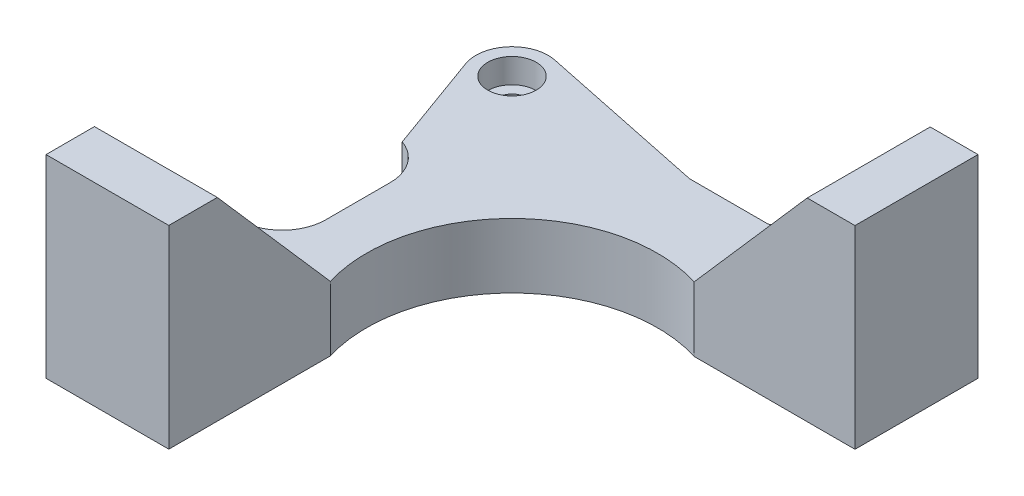
ISO-10303-21;
HEADER;
FILE_DESCRIPTION(('STEP AP214'),'2;1');
FILE_NAME('part.step','',(''),(''),'','','');
FILE_SCHEMA(('AUTOMOTIVE_DESIGN { 1 0 10303 214 1 1 1 1 }'));
ENDSEC;
DATA;
#1=APPLICATION_CONTEXT('core data for automotive mechanical design processes');
#2=APPLICATION_PROTOCOL_DEFINITION('international standard','automotive_design',2000,#1);
#3=PRODUCT_CONTEXT('',#1,'mechanical');
#4=PRODUCT('Part','Part','',(#3));
#5=PRODUCT_RELATED_PRODUCT_CATEGORY('part','',(#4));
#6=PRODUCT_DEFINITION_FORMATION('','',#4);
#7=PRODUCT_DEFINITION_CONTEXT('part definition',#1,'design');
#8=PRODUCT_DEFINITION('design','',#6,#7);
#9=PRODUCT_DEFINITION_SHAPE('','',#8);
#10=(LENGTH_UNIT() NAMED_UNIT(*) SI_UNIT(.MILLI.,.METRE.));
#11=(NAMED_UNIT(*) PLANE_ANGLE_UNIT() SI_UNIT($,.RADIAN.));
#12=(NAMED_UNIT(*) SI_UNIT($,.STERADIAN.) SOLID_ANGLE_UNIT());
#13=UNCERTAINTY_MEASURE_WITH_UNIT(LENGTH_MEASURE(1.E-05),#10,'distance_accuracy_value','');
#14=(GEOMETRIC_REPRESENTATION_CONTEXT(3) GLOBAL_UNCERTAINTY_ASSIGNED_CONTEXT((#13)) GLOBAL_UNIT_ASSIGNED_CONTEXT((#10,
#11,#12)) REPRESENTATION_CONTEXT('',''));
#15=CARTESIAN_POINT('',(0.,0.,0.));
#16=DIRECTION('',(0.,0.,1.));
#17=DIRECTION('',(1.,0.,0.));
#18=AXIS2_PLACEMENT_3D('',#15,#16,#17);
#19=CARTESIAN_POINT('',(0.,153.3525,0.));
#20=DIRECTION('',(0.,1.,0.));
#21=DIRECTION('',(0.,0.,1.));
#22=AXIS2_PLACEMENT_3D('',#19,#20,#21);
#23=PLANE('',#22);
#24=CARTESIAN_POINT('',(-41.275,153.3525,-111.125));
#25=DIRECTION('',(0.,1.,0.));
#26=DIRECTION('',(0.,0.,1.));
#27=AXIS2_PLACEMENT_3D('',#24,#25,#26);
#28=CIRCLE('',#27,4.7625);
#29=CARTESIAN_POINT('',(-41.275,153.3525,-106.3625));
#30=VERTEX_POINT('',#29);
#31=EDGE_CURVE('E489',#30,#30,#28,.T.);
#32=ORIENTED_EDGE('',*,*,#31,.F.);
#33=EDGE_LOOP('',(#32));
#34=FACE_BOUND('',#33,.T.);
#35=CARTESIAN_POINT('',(-111.125,153.3525,-41.275));
#36=DIRECTION('',(0.,1.,0.));
#37=DIRECTION('',(0.,0.,1.));
#38=AXIS2_PLACEMENT_3D('',#35,#36,#37);
#39=CIRCLE('',#38,4.7625);
#40=CARTESIAN_POINT('',(-111.125,153.3525,-36.5125));
#41=VERTEX_POINT('',#40);
#42=EDGE_CURVE('E501',#41,#41,#39,.T.);
#43=ORIENTED_EDGE('',*,*,#42,.F.);
#44=EDGE_LOOP('',(#43));
#45=FACE_BOUND('',#44,.T.);
#46=CARTESIAN_POINT('',(-111.125,153.3525,-111.125));
#47=DIRECTION('',(0.,1.,0.));
#48=DIRECTION('',(0.,0.,1.));
#49=AXIS2_PLACEMENT_3D('',#46,#47,#48);
#50=CIRCLE('',#49,4.7625);
#51=CARTESIAN_POINT('',(-111.125,153.3525,-106.3625));
#52=VERTEX_POINT('',#51);
#53=EDGE_CURVE('E513',#52,#52,#50,.T.);
#54=ORIENTED_EDGE('',*,*,#53,.F.);
#55=EDGE_LOOP('',(#54));
#56=FACE_BOUND('',#55,.T.);
#57=DIRECTION('',(-1.,0.,0.));
#58=VECTOR('',#57,1.);
#59=CARTESIAN_POINT('',(-94.0562495805783,153.3525,-36.107170818109));
#60=LINE('',#59,#58);
#61=CARTESIAN_POINT('',(-103.581249580578,153.3525,-36.107170818109));
#62=VERTEX_POINT('',#61);
#63=CARTESIAN_POINT('',(-118.197829181891,153.3525,-36.107170818109));
#64=VERTEX_POINT('',#63);
#65=EDGE_CURVE('E344',#62,#64,#60,.T.);
#66=ORIENTED_EDGE('',*,*,#65,.F.);
#67=DIRECTION('',(0.,0.,1.));
#68=VECTOR('',#67,1.);
#69=CARTESIAN_POINT('',(-103.581249580578,153.3525,-58.3437504194217));
#70=LINE('',#69,#68);
#71=CARTESIAN_POINT('',(-103.581249580578,153.3525,-58.3437504194217));
#72=VERTEX_POINT('',#71);
#73=EDGE_CURVE('E235',#72,#62,#70,.T.);
#74=ORIENTED_EDGE('',*,*,#73,.F.);
#75=DIRECTION('',(-1.,0.,0.));
#76=VECTOR('',#75,1.);
#77=CARTESIAN_POINT('',(-94.0562495805783,153.3525,-58.3437504194217));
#78=LINE('',#77,#76);
#79=CARTESIAN_POINT('',(-94.0562495805783,153.3525,-58.3437504194217));
#80=VERTEX_POINT('',#79);
#81=EDGE_CURVE('E219',#80,#72,#78,.T.);
#82=ORIENTED_EDGE('',*,*,#81,.F.);
#83=CARTESIAN_POINT('',(-66.675,153.3525,-66.675));
#84=DIRECTION('',(0.,1.,0.));
#85=DIRECTION('',(0.,0.,1.));
#86=AXIS2_PLACEMENT_3D('',#83,#84,#85);
#87=CIRCLE('',#86,28.620666452195);
#88=CARTESIAN_POINT('',(-58.204292246255,153.3525,-94.0134282342355));
#89=VERTEX_POINT('',#88);
#90=EDGE_CURVE('E233',#89,#80,#87,.T.);
#91=ORIENTED_EDGE('',*,*,#90,.F.);
#92=DIRECTION('',(0.,0.,1.));
#93=VECTOR('',#92,1.);
#94=CARTESIAN_POINT('',(-58.204292246255,153.3525,-94.0134282342355));
#95=LINE('',#94,#93);
#96=CARTESIAN_POINT('',(-58.204292246255,153.3525,-103.538428234236));
#97=VERTEX_POINT('',#96);
#98=EDGE_CURVE('E316',#97,#89,#95,.T.);
#99=ORIENTED_EDGE('',*,*,#98,.F.);
#100=DIRECTION('',(1.,0.,0.));
#101=VECTOR('',#100,1.);
#102=CARTESIAN_POINT('',(-58.204292246255,153.3525,-103.538428234236));
#103=LINE('',#102,#101);
#104=CARTESIAN_POINT('',(-36.1071708180816,153.3525,-103.538428234236));
#105=VERTEX_POINT('',#104);
#106=EDGE_CURVE('E485',#97,#105,#103,.T.);
#107=ORIENTED_EDGE('',*,*,#106,.T.);
#108=DIRECTION('',(0.,0.,1.));
#109=VECTOR('',#108,1.);
#110=CARTESIAN_POINT('',(-36.1071708180816,153.3525,-94.0134282342355));
#111=LINE('',#110,#109);
#112=CARTESIAN_POINT('',(-36.1071708180816,153.3525,-118.197829181918));
#113=VERTEX_POINT('',#112);
#114=EDGE_CURVE('E330',#113,#105,#111,.T.);
#115=ORIENTED_EDGE('',*,*,#114,.F.);
#116=DIRECTION('',(-1.,0.,0.));
#117=VECTOR('',#116,1.);
#118=CARTESIAN_POINT('',(-41.275,153.3525,-118.197829181918));
#119=LINE('',#118,#117);
#120=CARTESIAN_POINT('',(-41.275,153.3525,-118.197829181918));
#121=VERTEX_POINT('',#120);
#122=EDGE_CURVE('E311',#113,#121,#119,.T.);
#123=ORIENTED_EDGE('',*,*,#122,.T.);
#124=CARTESIAN_POINT('',(-41.275,153.3525,-111.125));
#125=DIRECTION('',(0.,1.,0.));
#126=DIRECTION('',(0.,0.,1.));
#127=AXIS2_PLACEMENT_3D('',#124,#125,#126);
#128=CIRCLE('',#127,7.07282918191839);
#129=CARTESIAN_POINT('',(-43.832903241686,153.3525,-117.719091570699));
#130=VERTEX_POINT('',#129);
#131=EDGE_CURVE('E252',#121,#130,#128,.T.);
#132=ORIENTED_EDGE('',*,*,#131,.T.);
#133=DIRECTION('',(0.932313138221565,0.,-0.361652059719639));
#134=VECTOR('',#133,1.);
#135=CARTESIAN_POINT('',(-45.4246977334963,153.3525,-117.101621181178));
#136=LINE('',#135,#134);
#137=CARTESIAN_POINT('',(-60.8319995851853,153.3525,-111.125));
#138=VERTEX_POINT('',#137);
#139=EDGE_CURVE('E255',#138,#130,#136,.T.);
#140=ORIENTED_EDGE('',*,*,#139,.F.);
#141=DIRECTION('',(-1.,0.,0.));
#142=VECTOR('',#141,1.);
#143=CARTESIAN_POINT('',(0.,153.3525,-111.125));
#144=LINE('',#143,#142);
#145=CARTESIAN_POINT('',(-76.2,153.3525,-111.125));
#146=VERTEX_POINT('',#145);
#147=EDGE_CURVE('E264',#138,#146,#144,.T.);
#148=ORIENTED_EDGE('',*,*,#147,.T.);
#149=DIRECTION('',(-0.979046593071524,0.,-0.203636363636364));
#150=VECTOR('',#149,1.);
#151=CARTESIAN_POINT('',(18.9950903919091,153.3525,-91.3249392259495));
#152=LINE('',#151,#150);
#153=CARTESIAN_POINT('',(-109.676738181818,153.3525,-118.087979369925));
#154=VERTEX_POINT('',#153);
#155=EDGE_CURVE('E266',#146,#154,#152,.T.);
#156=ORIENTED_EDGE('',*,*,#155,.T.);
#157=CARTESIAN_POINT('',(-111.125,153.3525,-111.125));
#158=DIRECTION('',(0.,1.,0.));
#159=DIRECTION('',(0.,0.,1.));
#160=AXIS2_PLACEMENT_3D('',#157,#158,#159);
#161=CIRCLE('',#160,7.112);
#162=CARTESIAN_POINT('',(-117.812544275955,153.3525,-108.704814974606));
#163=VERTEX_POINT('',#162);
#164=EDGE_CURVE('E268',#154,#163,#161,.T.);
#165=ORIENTED_EDGE('',*,*,#164,.T.);
#166=DIRECTION('',(-0.340295982198247,0.,-0.940318374009426));
#167=VECTOR('',#166,1.);
#168=CARTESIAN_POINT('',(-69.3856116478566,153.3525,25.1102663935575));
#169=LINE('',#168,#167);
#170=CARTESIAN_POINT('',(-110.73974168524,153.3525,-89.160986720071));
#171=VERTEX_POINT('',#170);
#172=EDGE_CURVE('E270',#171,#163,#169,.T.);
#173=ORIENTED_EDGE('',*,*,#172,.F.);
#174=CARTESIAN_POINT('',(-113.562518198404,153.3525,-81.0665633924503));
#175=DIRECTION('',(0.,1.,0.));
#176=DIRECTION('',(0.,0.,1.));
#177=AXIS2_PLACEMENT_3D('',#174,#175,#176);
#178=CIRCLE('',#177,8.5725);
#179=CARTESIAN_POINT('',(-104.990018198404,153.3525,-81.0665633924503));
#180=VERTEX_POINT('',#179);
#181=EDGE_CURVE('E368',#180,#171,#178,.T.);
#182=ORIENTED_EDGE('',*,*,#181,.F.);
#183=DIRECTION('',(0.,0.,1.));
#184=VECTOR('',#183,1.);
#185=CARTESIAN_POINT('',(-104.990018198404,153.3525,4.58906832912148E-13));
#186=LINE('',#185,#184);
#187=CARTESIAN_POINT('',(-104.990018198404,153.3525,-68.3665633924507));
#188=VERTEX_POINT('',#187);
#189=EDGE_CURVE('E376',#180,#188,#186,.T.);
#190=ORIENTED_EDGE('',*,*,#189,.T.);
#191=CARTESIAN_POINT('',(-113.562518198404,153.3525,-68.3665633924507));
#192=DIRECTION('',(0.,1.,0.));
#193=DIRECTION('',(0.,0.,1.));
#194=AXIS2_PLACEMENT_3D('',#191,#192,#193);
#195=CIRCLE('',#194,8.57250000000006);
#196=CARTESIAN_POINT('',(-110.711477128956,153.3525,-60.2820522093105));
#197=VERTEX_POINT('',#196);
#198=EDGE_CURVE('E378',#197,#188,#195,.T.);
#199=ORIENTED_EDGE('',*,*,#198,.F.);
#200=DIRECTION('',(-0.392129872066671,0.,0.919909867015772));
#201=VECTOR('',#200,1.);
#202=CARTESIAN_POINT('',(-115.433025578802,153.3525,-49.2056223935562));
#203=LINE('',#202,#201);
#204=CARTESIAN_POINT('',(-117.631365352139,153.3525,-44.0484676022443));
#205=VERTEX_POINT('',#204);
#206=EDGE_CURVE('E258',#197,#205,#203,.T.);
#207=ORIENTED_EDGE('',*,*,#206,.T.);
#208=CARTESIAN_POINT('',(-111.125,153.3525,-41.275));
#209=DIRECTION('',(0.,1.,0.));
#210=DIRECTION('',(0.,0.,1.));
#211=AXIS2_PLACEMENT_3D('',#208,#209,#210);
#212=CIRCLE('',#211,7.07282918189104);
#213=CARTESIAN_POINT('',(-118.197829181891,153.3525,-41.2749999999999));
#214=VERTEX_POINT('',#213);
#215=EDGE_CURVE('E253',#205,#214,#212,.T.);
#216=ORIENTED_EDGE('',*,*,#215,.T.);
#217=DIRECTION('',(0.,0.,1.));
#218=VECTOR('',#217,1.);
#219=CARTESIAN_POINT('',(-118.197829181891,153.3525,-41.2749999999999));
#220=LINE('',#219,#218);
#221=EDGE_CURVE('E360',#214,#64,#220,.T.);
#222=ORIENTED_EDGE('',*,*,#221,.T.);
#223=EDGE_LOOP('',(#66,#74,#82,#91,#99,#107,#115,#123,#132,#140,#148,#156,#165,#173,#182,#190,
#199,#207,#216,#222));
#224=FACE_BOUND('',#223,.T.);
#225=ADVANCED_FACE('F41',(#34,#45,#56,#224),#23,.T.);
#226=CARTESIAN_POINT('',(-94.0562495805783,178.7525,-36.107170818109));
#227=DIRECTION('',(0.,0.,1.));
#228=DIRECTION('',(1.,0.,0.));
#229=AXIS2_PLACEMENT_3D('',#226,#227,#228);
#230=PLANE('',#229);
#231=DIRECTION('',(0.,1.,0.));
#232=VECTOR('',#231,1.);
#233=CARTESIAN_POINT('',(-103.581249580578,178.7525,-36.107170818109));
#234=LINE('',#233,#232);
#235=CARTESIAN_POINT('',(-103.581249580578,178.7525,-36.107170818109));
#236=VERTEX_POINT('',#235);
#237=EDGE_CURVE('E237',#62,#236,#234,.T.);
#238=ORIENTED_EDGE('',*,*,#237,.F.);
#239=ORIENTED_EDGE('',*,*,#65,.T.);
#240=DIRECTION('',(0.,-1.,0.));
#241=VECTOR('',#240,1.);
#242=CARTESIAN_POINT('',(-118.197829181891,178.7525,-36.107170818109));
#243=LINE('',#242,#241);
#244=CARTESIAN_POINT('',(-118.197829181891,178.7525,-36.107170818109));
#245=VERTEX_POINT('',#244);
#246=EDGE_CURVE('E350',#245,#64,#243,.T.);
#247=ORIENTED_EDGE('',*,*,#246,.F.);
#248=DIRECTION('',(-1.,0.,0.));
#249=VECTOR('',#248,1.);
#250=CARTESIAN_POINT('',(-94.0562495805783,178.7525,-36.107170818109));
#251=LINE('',#250,#249);
#252=EDGE_CURVE('E335',#236,#245,#251,.T.);
#253=ORIENTED_EDGE('',*,*,#252,.F.);
#254=EDGE_LOOP('',(#238,#239,#247,#253));
#255=FACE_BOUND('',#254,.T.);
#256=ADVANCED_FACE('F476',(#255),#230,.F.);
#257=CARTESIAN_POINT('',(-36.1071708180816,178.7525,-94.0134282342355));
#258=DIRECTION('',(1.,0.,0.));
#259=DIRECTION('',(0.,0.,-1.));
#260=AXIS2_PLACEMENT_3D('',#257,#258,#259);
#261=PLANE('',#260);
#262=DIRECTION('',(0.,-1.,0.));
#263=VECTOR('',#262,1.);
#264=CARTESIAN_POINT('',(-36.1071708180816,178.7525,-103.538428234236));
#265=LINE('',#264,#263);
#266=CARTESIAN_POINT('',(-36.1071708180816,178.60635306077,-103.538428234236));
#267=VERTEX_POINT('',#266);
#268=EDGE_CURVE('E306',#267,#105,#265,.T.);
#269=ORIENTED_EDGE('',*,*,#268,.F.);
#270=DIRECTION('',(0.,0.,1.));
#271=VECTOR('',#270,1.);
#272=CARTESIAN_POINT('',(-36.1071708180816,178.60635306077,0.));
#273=LINE('',#272,#271);
#274=CARTESIAN_POINT('',(-36.1071708180816,178.60635306077,-118.197829181918));
#275=VERTEX_POINT('',#274);
#276=EDGE_CURVE('E297',#267,#275,#273,.F.);
#277=ORIENTED_EDGE('',*,*,#276,.T.);
#278=DIRECTION('',(0.,-1.,0.));
#279=VECTOR('',#278,1.);
#280=CARTESIAN_POINT('',(-36.1071708180816,178.7525,-118.197829181918));
#281=LINE('',#280,#279);
#282=EDGE_CURVE('E304',#275,#113,#281,.T.);
#283=ORIENTED_EDGE('',*,*,#282,.T.);
#284=ORIENTED_EDGE('',*,*,#114,.T.);
#285=EDGE_LOOP('',(#269,#277,#283,#284));
#286=FACE_BOUND('',#285,.T.);
#287=ADVANCED_FACE('F302',(#286),#261,.F.);
#288=CARTESIAN_POINT('',(-41.275,140.6525,-111.125));
#289=DIRECTION('',(0.,-1.,0.));
#290=DIRECTION('',(0.,0.,-1.));
#291=AXIS2_PLACEMENT_3D('',#288,#289,#290);
#292=PLANE('',#291);
#293=CARTESIAN_POINT('',(-41.275,140.6525,-111.125));
#294=DIRECTION('',(0.,1.,0.));
#295=DIRECTION('',(0.,0.,1.));
#296=AXIS2_PLACEMENT_3D('',#293,#294,#295);
#297=CIRCLE('',#296,2.5527);
#298=CARTESIAN_POINT('',(-41.275,140.6525,-108.5723));
#299=VERTEX_POINT('',#298);
#300=EDGE_CURVE('E498',#299,#299,#297,.T.);
#301=ORIENTED_EDGE('',*,*,#300,.T.);
#302=EDGE_LOOP('',(#301));
#303=FACE_BOUND('',#302,.T.);
#304=CARTESIAN_POINT('',(-111.125,140.6525,-41.275));
#305=DIRECTION('',(0.,1.,0.));
#306=DIRECTION('',(0.,0.,1.));
#307=AXIS2_PLACEMENT_3D('',#304,#305,#306);
#308=CIRCLE('',#307,2.55269999999999);
#309=CARTESIAN_POINT('',(-111.125,140.6525,-38.7223));
#310=VERTEX_POINT('',#309);
#311=EDGE_CURVE('E510',#310,#310,#308,.T.);
#312=ORIENTED_EDGE('',*,*,#311,.T.);
#313=EDGE_LOOP('',(#312));
#314=FACE_BOUND('',#313,.T.);
#315=CARTESIAN_POINT('',(-41.275,140.6525,-111.125));
#316=DIRECTION('',(0.,-1.,0.));
#317=DIRECTION('',(0.,0.,-1.));
#318=AXIS2_PLACEMENT_3D('',#315,#316,#317);
#319=CIRCLE('',#318,7.07282918191838);
#320=CARTESIAN_POINT('',(-43.832903241686,140.6525,-117.719091570699));
#321=VERTEX_POINT('',#320);
#322=CARTESIAN_POINT('',(-41.275,140.6525,-118.197829181918));
#323=VERTEX_POINT('',#322);
#324=EDGE_CURVE('E438',#321,#323,#319,.T.);
#325=ORIENTED_EDGE('',*,*,#324,.T.);
#326=DIRECTION('',(1.,0.,0.));
#327=VECTOR('',#326,1.);
#328=CARTESIAN_POINT('',(-41.275,140.6525,-118.197829181918));
#329=LINE('',#328,#327);
#330=CARTESIAN_POINT('',(-26.5821708180816,140.6525,-118.197829181918));
#331=VERTEX_POINT('',#330);
#332=EDGE_CURVE('E446',#323,#331,#329,.T.);
#333=ORIENTED_EDGE('',*,*,#332,.T.);
#334=DIRECTION('',(0.,0.,1.));
#335=VECTOR('',#334,1.);
#336=CARTESIAN_POINT('',(-26.5821708180816,140.6525,-118.197829181918));
#337=LINE('',#336,#335);
#338=CARTESIAN_POINT('',(-26.5821708180816,140.6525,-94.0134282342355));
#339=VERTEX_POINT('',#338);
#340=EDGE_CURVE('E449',#331,#339,#337,.T.);
#341=ORIENTED_EDGE('',*,*,#340,.T.);
#342=DIRECTION('',(-1.,0.,0.));
#343=VECTOR('',#342,1.);
#344=CARTESIAN_POINT('',(-26.5821708180816,140.6525,-94.0134282342355));
#345=LINE('',#344,#343);
#346=CARTESIAN_POINT('',(-58.204292246255,140.6525,-94.0134282342355));
#347=VERTEX_POINT('',#346);
#348=EDGE_CURVE('E458',#339,#347,#345,.T.);
#349=ORIENTED_EDGE('',*,*,#348,.T.);
#350=CARTESIAN_POINT('',(-66.675,140.6525,-66.675));
#351=DIRECTION('',(0.,1.,0.));
#352=DIRECTION('',(0.,0.,-1.));
#353=AXIS2_PLACEMENT_3D('',#350,#351,#352);
#354=CIRCLE('',#353,28.620666452195);
#355=CARTESIAN_POINT('',(-94.0562495805783,140.6525,-58.3437504194218));
#356=VERTEX_POINT('',#355);
#357=EDGE_CURVE('E460',#347,#356,#354,.T.);
#358=ORIENTED_EDGE('',*,*,#357,.T.);
#359=DIRECTION('',(0.,0.,1.));
#360=VECTOR('',#359,1.);
#361=CARTESIAN_POINT('',(-94.0562495805783,140.6525,-58.3437504194218));
#362=LINE('',#361,#360);
#363=CARTESIAN_POINT('',(-94.0562495805783,140.6525,-26.582170818109));
#364=VERTEX_POINT('',#363);
#365=EDGE_CURVE('E243',#356,#364,#362,.T.);
#366=ORIENTED_EDGE('',*,*,#365,.T.);
#367=DIRECTION('',(-1.,0.,0.));
#368=VECTOR('',#367,1.);
#369=CARTESIAN_POINT('',(-94.0562495805783,140.6525,-26.582170818109));
#370=LINE('',#369,#368);
#371=CARTESIAN_POINT('',(-118.197829181891,140.6525,-26.582170818109));
#372=VERTEX_POINT('',#371);
#373=EDGE_CURVE('E406',#364,#372,#370,.T.);
#374=ORIENTED_EDGE('',*,*,#373,.T.);
#375=DIRECTION('',(0.,0.,-1.));
#376=VECTOR('',#375,1.);
#377=CARTESIAN_POINT('',(-118.197829181891,140.6525,-26.582170818109));
#378=LINE('',#377,#376);
#379=CARTESIAN_POINT('',(-118.197829181891,140.6525,-41.2749999999999));
#380=VERTEX_POINT('',#379);
#381=EDGE_CURVE('E398',#372,#380,#378,.T.);
#382=ORIENTED_EDGE('',*,*,#381,.T.);
#383=CARTESIAN_POINT('',(-111.125,140.6525,-41.275));
#384=DIRECTION('',(0.,-1.,0.));
#385=DIRECTION('',(0.,0.,-1.));
#386=AXIS2_PLACEMENT_3D('',#383,#384,#385);
#387=CIRCLE('',#386,7.07282918189103);
#388=CARTESIAN_POINT('',(-117.631365352139,140.6525,-44.0484676022443));
#389=VERTEX_POINT('',#388);
#390=EDGE_CURVE('E393',#380,#389,#387,.T.);
#391=ORIENTED_EDGE('',*,*,#390,.T.);
#392=DIRECTION('',(0.392129872066672,0.,-0.919909867015772));
#393=VECTOR('',#392,1.);
#394=CARTESIAN_POINT('',(-117.631365352139,140.6525,-44.0484676022443));
#395=LINE('',#394,#393);
#396=CARTESIAN_POINT('',(-110.711477128956,140.6525,-60.2820522093105));
#397=VERTEX_POINT('',#396);
#398=EDGE_CURVE('E388',#389,#397,#395,.T.);
#399=ORIENTED_EDGE('',*,*,#398,.T.);
#400=CARTESIAN_POINT('',(-113.562518198404,140.6525,-68.3665633924507));
#401=DIRECTION('',(0.,1.,0.));
#402=DIRECTION('',(0.,0.,-1.));
#403=AXIS2_PLACEMENT_3D('',#400,#401,#402);
#404=CIRCLE('',#403,8.57250000000006);
#405=CARTESIAN_POINT('',(-104.990018198404,140.6525,-68.3665633924507));
#406=VERTEX_POINT('',#405);
#407=EDGE_CURVE('E413',#397,#406,#404,.T.);
#408=ORIENTED_EDGE('',*,*,#407,.T.);
#409=DIRECTION('',(0.,0.,-1.));
#410=VECTOR('',#409,1.);
#411=CARTESIAN_POINT('',(-104.990018198404,140.6525,-68.3665633924507));
#412=LINE('',#411,#410);
#413=CARTESIAN_POINT('',(-104.990018198404,140.6525,-81.0665633924503));
#414=VERTEX_POINT('',#413);
#415=EDGE_CURVE('E416',#406,#414,#412,.T.);
#416=ORIENTED_EDGE('',*,*,#415,.T.);
#417=CARTESIAN_POINT('',(-113.562518198404,140.6525,-81.0665633924503));
#418=DIRECTION('',(0.,1.,0.));
#419=DIRECTION('',(0.,0.,-1.));
#420=AXIS2_PLACEMENT_3D('',#417,#418,#419);
#421=CIRCLE('',#420,8.5725);
#422=CARTESIAN_POINT('',(-110.73974168524,140.6525,-89.160986720071));
#423=VERTEX_POINT('',#422);
#424=EDGE_CURVE('E419',#414,#423,#421,.T.);
#425=ORIENTED_EDGE('',*,*,#424,.T.);
#426=DIRECTION('',(-0.340295982198247,0.,-0.940318374009426));
#427=VECTOR('',#426,1.);
#428=CARTESIAN_POINT('',(-110.73974168524,140.6525,-89.160986720071));
#429=LINE('',#428,#427);
#430=CARTESIAN_POINT('',(-117.812544275955,140.6525,-108.704814974606));
#431=VERTEX_POINT('',#430);
#432=EDGE_CURVE('E422',#423,#431,#429,.T.);
#433=ORIENTED_EDGE('',*,*,#432,.T.);
#434=CARTESIAN_POINT('',(-111.125,140.6525,-111.125));
#435=DIRECTION('',(0.,-1.,0.));
#436=DIRECTION('',(0.,0.,-1.));
#437=AXIS2_PLACEMENT_3D('',#434,#435,#436);
#438=CIRCLE('',#437,7.11199999999999);
#439=CARTESIAN_POINT('',(-109.676738181818,140.6525,-118.087979369925));
#440=VERTEX_POINT('',#439);
#441=EDGE_CURVE('E425',#431,#440,#438,.T.);
#442=ORIENTED_EDGE('',*,*,#441,.T.);
#443=DIRECTION('',(0.979046593071524,0.,0.203636363636363));
#444=VECTOR('',#443,1.);
#445=CARTESIAN_POINT('',(-109.676738181818,140.6525,-118.087979369925));
#446=LINE('',#445,#444);
#447=CARTESIAN_POINT('',(-76.2,140.6525,-111.125));
#448=VERTEX_POINT('',#447);
#449=EDGE_CURVE('E428',#440,#448,#446,.T.);
#450=ORIENTED_EDGE('',*,*,#449,.T.);
#451=DIRECTION('',(1.,0.,0.));
#452=VECTOR('',#451,1.);
#453=CARTESIAN_POINT('',(-76.2,140.6525,-111.125));
#454=LINE('',#453,#452);
#455=CARTESIAN_POINT('',(-60.8319995851853,140.6525,-111.125));
#456=VERTEX_POINT('',#455);
#457=EDGE_CURVE('E431',#448,#456,#454,.T.);
#458=ORIENTED_EDGE('',*,*,#457,.T.);
#459=DIRECTION('',(0.932313138221565,0.,-0.361652059719639));
#460=VECTOR('',#459,1.);
#461=CARTESIAN_POINT('',(-60.8319995851853,140.6525,-111.125));
#462=LINE('',#461,#460);
#463=EDGE_CURVE('E313',#456,#321,#462,.T.);
#464=ORIENTED_EDGE('',*,*,#463,.T.);
#465=EDGE_LOOP('',(#325,#333,#341,#349,#358,#366,#374,#382,#391,#399,#408,#416,#425,#433,#442,
#450,#458,#464));
#466=FACE_BOUND('',#465,.T.);
#467=CARTESIAN_POINT('',(-111.125,140.6525,-111.125));
#468=DIRECTION('',(0.,1.,0.));
#469=DIRECTION('',(0.,0.,1.));
#470=AXIS2_PLACEMENT_3D('',#467,#468,#469);
#471=CIRCLE('',#470,2.55269999999999);
#472=CARTESIAN_POINT('',(-111.125,140.6525,-108.5723));
#473=VERTEX_POINT('',#472);
#474=EDGE_CURVE('E447',#473,#473,#471,.T.);
#475=ORIENTED_EDGE('',*,*,#474,.T.);
#476=EDGE_LOOP('',(#475));
#477=FACE_BOUND('',#476,.T.);
#478=ADVANCED_FACE('F403',(#303,#314,#466,#477),#292,.T.);
#479=DIRECTION('',(0.00121570527621527,0.,0.999999261030068));
#480=VECTOR('',#479,1.);
#481=CARTESIAN_POINT('',(-118.197829181891,153.3525,-36.107170818109));
#482=LINE('',#481,#480);
#483=CARTESIAN_POINT('',(-118.186249580578,153.3525,-26.582170818109));
#484=VERTEX_POINT('',#483);
#485=EDGE_CURVE('E336',#64,#484,#482,.T.);
#486=ORIENTED_EDGE('',*,*,#485,.F.);
#487=CARTESIAN_POINT('',(-118.197829181891,153.3525,-26.582170818109));
#488=VERTEX_POINT('',#487);
#489=EDGE_CURVE('E359',#64,#488,#220,.T.);
#490=ORIENTED_EDGE('',*,*,#489,.T.);
#491=DIRECTION('',(1.,0.,0.));
#492=VECTOR('',#491,1.);
#493=CARTESIAN_POINT('',(-111.125,153.3525,-26.582170818109));
#494=LINE('',#493,#492);
#495=EDGE_CURVE('E363',#488,#484,#494,.T.);
#496=ORIENTED_EDGE('',*,*,#495,.T.);
#497=EDGE_LOOP('',(#486,#490,#496));
#498=FACE_BOUND('',#497,.T.);
#499=ADVANCED_FACE('F467',(#498),#23,.T.);
#500=CARTESIAN_POINT('',(-111.125,153.3525,-41.275));
#501=DIRECTION('',(0.,-1.,0.));
#502=DIRECTION('',(0.,0.,-1.));
#503=AXIS2_PLACEMENT_3D('',#500,#501,#502);
#504=CYLINDRICAL_SURFACE('',#503,7.07282918189104);
#505=DIRECTION('',(0.,1.,0.));
#506=VECTOR('',#505,1.);
#507=CARTESIAN_POINT('',(-118.197829181891,150.8125,-41.2749999999999));
#508=LINE('',#507,#506);
#509=EDGE_CURVE('E365',#380,#214,#508,.T.);
#510=ORIENTED_EDGE('',*,*,#509,.T.);
#511=ORIENTED_EDGE('',*,*,#215,.F.);
#512=DIRECTION('',(0.,-1.,0.));
#513=VECTOR('',#512,1.);
#514=CARTESIAN_POINT('',(-117.631365352139,153.3525,-44.0484676022443));
#515=LINE('',#514,#513);
#516=EDGE_CURVE('E247',#205,#389,#515,.T.);
#517=ORIENTED_EDGE('',*,*,#516,.T.);
#518=ORIENTED_EDGE('',*,*,#390,.F.);
#519=EDGE_LOOP('',(#510,#511,#517,#518));
#520=FACE_BOUND('',#519,.T.);
#521=ADVANCED_FACE('F392',(#520),#504,.T.);
#522=CARTESIAN_POINT('',(-113.562518198404,153.3525,-81.0665633924503));
#523=DIRECTION('',(0.,-1.,0.));
#524=DIRECTION('',(0.,0.,-1.));
#525=AXIS2_PLACEMENT_3D('',#522,#523,#524);
#526=CYLINDRICAL_SURFACE('',#525,8.5725);
#527=DIRECTION('',(0.,-1.,0.));
#528=VECTOR('',#527,1.);
#529=CARTESIAN_POINT('',(-110.73974168524,153.3525,-89.160986720071));
#530=LINE('',#529,#528);
#531=EDGE_CURVE('E273',#171,#423,#530,.T.);
#532=ORIENTED_EDGE('',*,*,#531,.T.);
#533=ORIENTED_EDGE('',*,*,#424,.F.);
#534=DIRECTION('',(0.,-1.,0.));
#535=VECTOR('',#534,1.);
#536=CARTESIAN_POINT('',(-104.990018198404,153.3525,-81.0665633924503));
#537=LINE('',#536,#535);
#538=EDGE_CURVE('E225',#180,#414,#537,.T.);
#539=ORIENTED_EDGE('',*,*,#538,.F.);
#540=ORIENTED_EDGE('',*,*,#181,.T.);
#541=EDGE_LOOP('',(#532,#533,#539,#540));
#542=FACE_BOUND('',#541,.T.);
#543=ADVANCED_FACE('F553',(#542),#526,.F.);
#544=CARTESIAN_POINT('',(-104.990018198404,153.3525,4.58906832912148E-13));
#545=DIRECTION('',(1.,0.,0.));
#546=DIRECTION('',(0.,0.,-1.));
#547=AXIS2_PLACEMENT_3D('',#544,#545,#546);
#548=PLANE('',#547);
#549=ORIENTED_EDGE('',*,*,#538,.T.);
#550=ORIENTED_EDGE('',*,*,#415,.F.);
#551=DIRECTION('',(0.,-1.,0.));
#552=VECTOR('',#551,1.);
#553=CARTESIAN_POINT('',(-104.990018198404,153.3525,-68.3665633924507));
#554=LINE('',#553,#552);
#555=EDGE_CURVE('E289',#188,#406,#554,.T.);
#556=ORIENTED_EDGE('',*,*,#555,.F.);
#557=ORIENTED_EDGE('',*,*,#189,.F.);
#558=EDGE_LOOP('',(#549,#550,#556,#557));
#559=FACE_BOUND('',#558,.T.);
#560=ADVANCED_FACE('F918',(#559),#548,.F.);
#561=CARTESIAN_POINT('',(-113.562518198404,153.3525,-68.3665633924507));
#562=DIRECTION('',(0.,-1.,0.));
#563=DIRECTION('',(0.,0.,-1.));
#564=AXIS2_PLACEMENT_3D('',#561,#562,#563);
#565=CYLINDRICAL_SURFACE('',#564,8.57250000000006);
#566=ORIENTED_EDGE('',*,*,#555,.T.);
#567=ORIENTED_EDGE('',*,*,#407,.F.);
#568=DIRECTION('',(0.,-1.,0.));
#569=VECTOR('',#568,1.);
#570=CARTESIAN_POINT('',(-110.711477128956,153.3525,-60.2820522093105));
#571=LINE('',#570,#569);
#572=EDGE_CURVE('E287',#197,#397,#571,.T.);
#573=ORIENTED_EDGE('',*,*,#572,.F.);
#574=ORIENTED_EDGE('',*,*,#198,.T.);
#575=EDGE_LOOP('',(#566,#567,#573,#574));
#576=FACE_BOUND('',#575,.T.);
#577=ADVANCED_FACE('F929',(#576),#565,.F.);
#578=CARTESIAN_POINT('',(-115.433025578802,153.3525,-49.2056223935562));
#579=DIRECTION('',(0.919909867015772,0.,0.392129872066671));
#580=DIRECTION('',(0.392129872066671,0.,-0.919909867015772));
#581=AXIS2_PLACEMENT_3D('',#578,#579,#580);
#582=PLANE('',#581);
#583=ORIENTED_EDGE('',*,*,#572,.T.);
#584=ORIENTED_EDGE('',*,*,#398,.F.);
#585=ORIENTED_EDGE('',*,*,#516,.F.);
#586=ORIENTED_EDGE('',*,*,#206,.F.);
#587=EDGE_LOOP('',(#583,#584,#585,#586));
#588=FACE_BOUND('',#587,.T.);
#589=ADVANCED_FACE('F386',(#588),#582,.F.);
#590=CARTESIAN_POINT('',(-66.675,153.3525,-66.675));
#591=DIRECTION('',(0.,-1.,0.));
#592=DIRECTION('',(0.,0.,-1.));
#593=AXIS2_PLACEMENT_3D('',#590,#591,#592);
#594=CYLINDRICAL_SURFACE('',#593,28.620666452195);
#595=DIRECTION('',(0.,-1.,0.));
#596=VECTOR('',#595,1.);
#597=CARTESIAN_POINT('',(-94.0562495805783,153.3525,-58.3437504194217));
#598=LINE('',#597,#596);
#599=EDGE_CURVE('E240',#80,#356,#598,.T.);
#600=ORIENTED_EDGE('',*,*,#599,.T.);
#601=ORIENTED_EDGE('',*,*,#357,.F.);
#602=DIRECTION('',(0.,-1.,0.));
#603=VECTOR('',#602,1.);
#604=CARTESIAN_POINT('',(-58.204292246255,153.3525,-94.0134282342355));
#605=LINE('',#604,#603);
#606=EDGE_CURVE('E248',#89,#347,#605,.T.);
#607=ORIENTED_EDGE('',*,*,#606,.F.);
#608=ORIENTED_EDGE('',*,*,#90,.T.);
#609=EDGE_LOOP('',(#600,#601,#607,#608));
#610=FACE_BOUND('',#609,.T.);
#611=ADVANCED_FACE('F251',(#610),#594,.F.);
#612=CARTESIAN_POINT('',(-41.275,153.3525,-111.125));
#613=DIRECTION('',(0.,-1.,0.));
#614=DIRECTION('',(0.,0.,-1.));
#615=AXIS2_PLACEMENT_3D('',#612,#613,#614);
#616=CYLINDRICAL_SURFACE('',#615,7.07282918191839);
#617=ORIENTED_EDGE('',*,*,#131,.F.);
#618=DIRECTION('',(0.,1.,0.));
#619=VECTOR('',#618,1.);
#620=CARTESIAN_POINT('',(-41.275,150.8125,-118.197829181918));
#621=LINE('',#620,#619);
#622=EDGE_CURVE('E353',#323,#121,#621,.T.);
#623=ORIENTED_EDGE('',*,*,#622,.F.);
#624=ORIENTED_EDGE('',*,*,#324,.F.);
#625=DIRECTION('',(0.,-1.,0.));
#626=VECTOR('',#625,1.);
#627=CARTESIAN_POINT('',(-43.832903241686,153.3525,-117.719091570699));
#628=LINE('',#627,#626);
#629=EDGE_CURVE('E283',#130,#321,#628,.T.);
#630=ORIENTED_EDGE('',*,*,#629,.F.);
#631=EDGE_LOOP('',(#617,#623,#624,#630));
#632=FACE_BOUND('',#631,.T.);
#633=ADVANCED_FACE('F444',(#632),#616,.T.);
#634=CARTESIAN_POINT('',(-45.4246977334963,153.3525,-117.101621181178));
#635=DIRECTION('',(-0.361652059719639,0.,-0.932313138221565));
#636=DIRECTION('',(-0.932313138221565,0.,0.361652059719639));
#637=AXIS2_PLACEMENT_3D('',#634,#635,#636);
#638=PLANE('',#637);
#639=ORIENTED_EDGE('',*,*,#629,.T.);
#640=ORIENTED_EDGE('',*,*,#463,.F.);
#641=DIRECTION('',(0.,-1.,0.));
#642=VECTOR('',#641,1.);
#643=CARTESIAN_POINT('',(-60.8319995851853,153.3525,-111.125));
#644=LINE('',#643,#642);
#645=EDGE_CURVE('E281',#138,#456,#644,.T.);
#646=ORIENTED_EDGE('',*,*,#645,.F.);
#647=ORIENTED_EDGE('',*,*,#139,.T.);
#648=EDGE_LOOP('',(#639,#640,#646,#647));
#649=FACE_BOUND('',#648,.T.);
#650=ADVANCED_FACE('F790',(#649),#638,.T.);
#651=CARTESIAN_POINT('',(0.,153.3525,-111.125));
#652=DIRECTION('',(0.,0.,1.));
#653=DIRECTION('',(1.,0.,0.));
#654=AXIS2_PLACEMENT_3D('',#651,#652,#653);
#655=PLANE('',#654);
#656=ORIENTED_EDGE('',*,*,#645,.T.);
#657=ORIENTED_EDGE('',*,*,#457,.F.);
#658=DIRECTION('',(0.,-1.,0.));
#659=VECTOR('',#658,1.);
#660=CARTESIAN_POINT('',(-76.2,153.3525,-111.125));
#661=LINE('',#660,#659);
#662=EDGE_CURVE('E279',#146,#448,#661,.T.);
#663=ORIENTED_EDGE('',*,*,#662,.F.);
#664=ORIENTED_EDGE('',*,*,#147,.F.);
#665=EDGE_LOOP('',(#656,#657,#663,#664));
#666=FACE_BOUND('',#665,.T.);
#667=ADVANCED_FACE('F801',(#666),#655,.F.);
#668=CARTESIAN_POINT('',(18.9950903919091,153.3525,-91.3249392259495));
#669=DIRECTION('',(-0.203636363636364,0.,0.979046593071524));
#670=DIRECTION('',(0.979046593071524,0.,0.203636363636364));
#671=AXIS2_PLACEMENT_3D('',#668,#669,#670);
#672=PLANE('',#671);
#673=ORIENTED_EDGE('',*,*,#662,.T.);
#674=ORIENTED_EDGE('',*,*,#449,.F.);
#675=DIRECTION('',(0.,-1.,0.));
#676=VECTOR('',#675,1.);
#677=CARTESIAN_POINT('',(-109.676738181818,153.3525,-118.087979369925));
#678=LINE('',#677,#676);
#679=EDGE_CURVE('E277',#154,#440,#678,.T.);
#680=ORIENTED_EDGE('',*,*,#679,.F.);
#681=ORIENTED_EDGE('',*,*,#155,.F.);
#682=EDGE_LOOP('',(#673,#674,#680,#681));
#683=FACE_BOUND('',#682,.T.);
#684=ADVANCED_FACE('F812',(#683),#672,.F.);
#685=CARTESIAN_POINT('',(-111.125,153.3525,-111.125));
#686=DIRECTION('',(0.,-1.,0.));
#687=DIRECTION('',(0.,0.,-1.));
#688=AXIS2_PLACEMENT_3D('',#685,#686,#687);
#689=CYLINDRICAL_SURFACE('',#688,7.112);
#690=ORIENTED_EDGE('',*,*,#679,.T.);
#691=ORIENTED_EDGE('',*,*,#441,.F.);
#692=DIRECTION('',(0.,-1.,0.));
#693=VECTOR('',#692,1.);
#694=CARTESIAN_POINT('',(-117.812544275955,153.3525,-108.704814974606));
#695=LINE('',#694,#693);
#696=EDGE_CURVE('E275',#163,#431,#695,.T.);
#697=ORIENTED_EDGE('',*,*,#696,.F.);
#698=ORIENTED_EDGE('',*,*,#164,.F.);
#699=EDGE_LOOP('',(#690,#691,#697,#698));
#700=FACE_BOUND('',#699,.T.);
#701=ADVANCED_FACE('F824',(#700),#689,.T.);
#702=CARTESIAN_POINT('',(-69.3856116478566,153.3525,25.1102663935575));
#703=DIRECTION('',(-0.940318374009426,0.,0.340295982198247));
#704=DIRECTION('',(0.340295982198247,0.,0.940318374009426));
#705=AXIS2_PLACEMENT_3D('',#702,#703,#704);
#706=PLANE('',#705);
#707=ORIENTED_EDGE('',*,*,#696,.T.);
#708=ORIENTED_EDGE('',*,*,#432,.F.);
#709=ORIENTED_EDGE('',*,*,#531,.F.);
#710=ORIENTED_EDGE('',*,*,#172,.T.);
#711=EDGE_LOOP('',(#707,#708,#709,#710));
#712=FACE_BOUND('',#711,.T.);
#713=ADVANCED_FACE('F583',(#712),#706,.T.);
#714=CARTESIAN_POINT('',(-94.0562495805783,150.8125,-58.3437504194217));
#715=DIRECTION('',(1.,0.,0.));
#716=DIRECTION('',(0.,0.,-1.));
#717=AXIS2_PLACEMENT_3D('',#714,#715,#716);
#718=PLANE('',#717);
#719=ORIENTED_EDGE('',*,*,#599,.F.);
#720=DIRECTION('',(0.,0.752576694706879,0.658504607868517));
#721=VECTOR('',#720,1.);
#722=CARTESIAN_POINT('',(-94.0562495805783,151.913915929203,-59.6025114813686));
#723=LINE('',#722,#721);
#724=CARTESIAN_POINT('',(-94.0562495805783,178.7525,-36.1187504194217));
#725=VERTEX_POINT('',#724);
#726=EDGE_CURVE('E215',#80,#725,#723,.T.);
#727=ORIENTED_EDGE('',*,*,#726,.T.);
#728=DIRECTION('',(0.,0.,-1.));
#729=VECTOR('',#728,1.);
#730=CARTESIAN_POINT('',(-94.0562495805783,178.7525,-36.107170818109));
#731=LINE('',#730,#729);
#732=CARTESIAN_POINT('',(-94.0562495805783,178.7525,-26.582170818109));
#733=VERTEX_POINT('',#732);
#734=EDGE_CURVE('E333',#733,#725,#731,.T.);
#735=ORIENTED_EDGE('',*,*,#734,.F.);
#736=DIRECTION('',(0.,1.,0.));
#737=VECTOR('',#736,1.);
#738=CARTESIAN_POINT('',(-94.0562495805783,150.8125,-26.582170818109));
#739=LINE('',#738,#737);
#740=EDGE_CURVE('E366',#364,#733,#739,.T.);
#741=ORIENTED_EDGE('',*,*,#740,.F.);
#742=ORIENTED_EDGE('',*,*,#365,.F.);
#743=EDGE_LOOP('',(#719,#727,#735,#741,#742));
#744=FACE_BOUND('',#743,.T.);
#745=ADVANCED_FACE('F241',(#744),#718,.T.);
#746=CARTESIAN_POINT('',(-111.125,150.8125,-26.582170818109));
#747=DIRECTION('',(0.,0.,1.));
#748=DIRECTION('',(1.,0.,0.));
#749=AXIS2_PLACEMENT_3D('',#746,#747,#748);
#750=PLANE('',#749);
#751=ORIENTED_EDGE('',*,*,#495,.F.);
#752=DIRECTION('',(0.,1.,0.));
#753=VECTOR('',#752,1.);
#754=CARTESIAN_POINT('',(-118.197829181891,150.8125,-26.582170818109));
#755=LINE('',#754,#753);
#756=EDGE_CURVE('E369',#372,#488,#755,.T.);
#757=ORIENTED_EDGE('',*,*,#756,.F.);
#758=ORIENTED_EDGE('',*,*,#373,.F.);
#759=ORIENTED_EDGE('',*,*,#740,.T.);
#760=DIRECTION('',(1.,0.,0.));
#761=VECTOR('',#760,1.);
#762=CARTESIAN_POINT('',(-94.0562495805783,178.7525,-26.582170818109));
#763=LINE('',#762,#761);
#764=CARTESIAN_POINT('',(-118.186249580578,178.7525,-26.582170818109));
#765=VERTEX_POINT('',#764);
#766=EDGE_CURVE('E340',#765,#733,#763,.T.);
#767=ORIENTED_EDGE('',*,*,#766,.F.);
#768=DIRECTION('',(0.,-1.,0.));
#769=VECTOR('',#768,1.);
#770=CARTESIAN_POINT('',(-118.186249580578,178.7525,-26.582170818109));
#771=LINE('',#770,#769);
#772=EDGE_CURVE('E343',#765,#484,#771,.T.);
#773=ORIENTED_EDGE('',*,*,#772,.T.);
#774=EDGE_LOOP('',(#751,#757,#758,#759,#767,#773));
#775=FACE_BOUND('',#774,.T.);
#776=ADVANCED_FACE('F463',(#775),#750,.T.);
#777=CARTESIAN_POINT('',(-118.197829181891,150.8125,-41.2749999999999));
#778=DIRECTION('',(-1.,0.,0.));
#779=DIRECTION('',(0.,0.,1.));
#780=AXIS2_PLACEMENT_3D('',#777,#778,#779);
#781=PLANE('',#780);
#782=ORIENTED_EDGE('',*,*,#221,.F.);
#783=ORIENTED_EDGE('',*,*,#509,.F.);
#784=ORIENTED_EDGE('',*,*,#381,.F.);
#785=ORIENTED_EDGE('',*,*,#756,.T.);
#786=ORIENTED_EDGE('',*,*,#489,.F.);
#787=EDGE_LOOP('',(#782,#783,#784,#785,#786));
#788=FACE_BOUND('',#787,.T.);
#789=ADVANCED_FACE('F397',(#788),#781,.T.);
#790=CARTESIAN_POINT('',(-41.275,150.8125,-118.197829181918));
#791=DIRECTION('',(0.,0.,-1.));
#792=DIRECTION('',(-1.,0.,0.));
#793=AXIS2_PLACEMENT_3D('',#790,#791,#792);
#794=PLANE('',#793);
#795=ORIENTED_EDGE('',*,*,#282,.F.);
#796=DIRECTION('',(-0.658504607868517,-0.752576694706879,0.));
#797=VECTOR('',#796,1.);
#798=CARTESIAN_POINT('',(-52.12203277664,160.30365367956,-118.197829181918));
#799=LINE('',#798,#797);
#800=CARTESIAN_POINT('',(-35.979292246255,178.7525,-118.197829181918));
#801=VERTEX_POINT('',#800);
#802=EDGE_CURVE('E64',#275,#801,#799,.F.);
#803=ORIENTED_EDGE('',*,*,#802,.T.);
#804=DIRECTION('',(-1.,0.,0.));
#805=VECTOR('',#804,1.);
#806=CARTESIAN_POINT('',(-36.1071708180816,178.7525,-118.197829181918));
#807=LINE('',#806,#805);
#808=CARTESIAN_POINT('',(-26.5821708180816,178.7525,-118.197829181918));
#809=VERTEX_POINT('',#808);
#810=EDGE_CURVE('E325',#809,#801,#807,.T.);
#811=ORIENTED_EDGE('',*,*,#810,.F.);
#812=DIRECTION('',(0.,1.,0.));
#813=VECTOR('',#812,1.);
#814=CARTESIAN_POINT('',(-26.5821708180816,150.8125,-118.197829181918));
#815=LINE('',#814,#813);
#816=EDGE_CURVE('E355',#331,#809,#815,.T.);
#817=ORIENTED_EDGE('',*,*,#816,.F.);
#818=ORIENTED_EDGE('',*,*,#332,.F.);
#819=ORIENTED_EDGE('',*,*,#622,.T.);
#820=ORIENTED_EDGE('',*,*,#122,.F.);
#821=EDGE_LOOP('',(#795,#803,#811,#817,#818,#819,#820));
#822=FACE_BOUND('',#821,.T.);
#823=ADVANCED_FACE('F309',(#822),#794,.T.);
#824=CARTESIAN_POINT('',(-26.5821708180816,150.8125,-118.197829181918));
#825=DIRECTION('',(1.,0.,0.));
#826=DIRECTION('',(0.,0.,-1.));
#827=AXIS2_PLACEMENT_3D('',#824,#825,#826);
#828=PLANE('',#827);
#829=ORIENTED_EDGE('',*,*,#816,.T.);
#830=DIRECTION('',(0.,0.,-1.));
#831=VECTOR('',#830,1.);
#832=CARTESIAN_POINT('',(-26.5821708180816,178.7525,-118.197829181918));
#833=LINE('',#832,#831);
#834=CARTESIAN_POINT('',(-26.5821708180816,178.7525,-94.0134282342355));
#835=VERTEX_POINT('',#834);
#836=EDGE_CURVE('E327',#835,#809,#833,.T.);
#837=ORIENTED_EDGE('',*,*,#836,.F.);
#838=DIRECTION('',(0.,1.,0.));
#839=VECTOR('',#838,1.);
#840=CARTESIAN_POINT('',(-26.5821708180816,150.8125,-94.0134282342355));
#841=LINE('',#840,#839);
#842=EDGE_CURVE('E322',#339,#835,#841,.T.);
#843=ORIENTED_EDGE('',*,*,#842,.F.);
#844=ORIENTED_EDGE('',*,*,#340,.F.);
#845=EDGE_LOOP('',(#829,#837,#843,#844));
#846=FACE_BOUND('',#845,.T.);
#847=ADVANCED_FACE('F576',(#846),#828,.T.);
#848=CARTESIAN_POINT('',(-58.204292246255,150.8125,-94.0134282342355));
#849=DIRECTION('',(0.,0.,1.));
#850=DIRECTION('',(1.,0.,0.));
#851=AXIS2_PLACEMENT_3D('',#848,#849,#850);
#852=PLANE('',#851);
#853=DIRECTION('',(1.,0.,0.));
#854=VECTOR('',#853,1.);
#855=CARTESIAN_POINT('',(-26.5821708180816,178.7525,-94.0134282342355));
#856=LINE('',#855,#854);
#857=CARTESIAN_POINT('',(-35.979292246255,178.7525,-94.0134282342355));
#858=VERTEX_POINT('',#857);
#859=EDGE_CURVE('E312',#858,#835,#856,.T.);
#860=ORIENTED_EDGE('',*,*,#859,.F.);
#861=DIRECTION('',(0.658504607868517,0.752576694706879,0.));
#862=VECTOR('',#861,1.);
#863=CARTESIAN_POINT('',(-59.4630533082019,151.913915929203,-94.0134282342355));
#864=LINE('',#863,#862);
#865=EDGE_CURVE('E11',#858,#89,#864,.F.);
#866=ORIENTED_EDGE('',*,*,#865,.T.);
#867=ORIENTED_EDGE('',*,*,#606,.T.);
#868=ORIENTED_EDGE('',*,*,#348,.F.);
#869=ORIENTED_EDGE('',*,*,#842,.T.);
#870=EDGE_LOOP('',(#860,#866,#867,#868,#869));
#871=FACE_BOUND('',#870,.T.);
#872=ADVANCED_FACE('F318',(#871),#852,.T.);
#873=CARTESIAN_POINT('',(-118.197829181891,178.7525,-36.107170818109));
#874=DIRECTION('',(0.999999261030068,0.,-0.00121570527621527));
#875=DIRECTION('',(-0.00121570527621527,0.,-0.999999261030068));
#876=AXIS2_PLACEMENT_3D('',#873,#874,#875);
#877=PLANE('',#876);
#878=ORIENTED_EDGE('',*,*,#485,.T.);
#879=ORIENTED_EDGE('',*,*,#772,.F.);
#880=DIRECTION('',(0.00121570527621527,0.,0.999999261030068));
#881=VECTOR('',#880,1.);
#882=CARTESIAN_POINT('',(-118.197829181891,178.7525,-36.107170818109));
#883=LINE('',#882,#881);
#884=EDGE_CURVE('E338',#245,#765,#883,.T.);
#885=ORIENTED_EDGE('',*,*,#884,.F.);
#886=ORIENTED_EDGE('',*,*,#246,.T.);
#887=EDGE_LOOP('',(#878,#879,#885,#886));
#888=FACE_BOUND('',#887,.T.);
#889=ADVANCED_FACE('F472',(#888),#877,.F.);
#890=CARTESIAN_POINT('',(0.,178.7525,0.));
#891=DIRECTION('',(0.,-1.,0.));
#892=DIRECTION('',(0.,0.,-1.));
#893=AXIS2_PLACEMENT_3D('',#890,#891,#892);
#894=PLANE('',#893);
#895=ORIENTED_EDGE('',*,*,#734,.T.);
#896=DIRECTION('',(-1.,0.,0.));
#897=VECTOR('',#896,1.);
#898=CARTESIAN_POINT('',(-103.581249580578,178.7525,-36.1187504194217));
#899=LINE('',#898,#897);
#900=CARTESIAN_POINT('',(-103.581249580578,178.7525,-36.1187504194217));
#901=VERTEX_POINT('',#900);
#902=EDGE_CURVE('E220',#725,#901,#899,.T.);
#903=ORIENTED_EDGE('',*,*,#902,.T.);
#904=DIRECTION('',(0.,0.,1.));
#905=VECTOR('',#904,1.);
#906=CARTESIAN_POINT('',(-103.581249580578,178.7525,-58.3437504194217));
#907=LINE('',#906,#905);
#908=EDGE_CURVE('E236',#901,#236,#907,.T.);
#909=ORIENTED_EDGE('',*,*,#908,.T.);
#910=ORIENTED_EDGE('',*,*,#252,.T.);
#911=ORIENTED_EDGE('',*,*,#884,.T.);
#912=ORIENTED_EDGE('',*,*,#766,.T.);
#913=EDGE_LOOP('',(#895,#903,#909,#910,#911,#912));
#914=FACE_BOUND('',#913,.T.);
#915=ADVANCED_FACE('F569',(#914),#894,.F.);
#916=CARTESIAN_POINT('',(0.,178.7525,0.));
#917=DIRECTION('',(0.,-1.,0.));
#918=DIRECTION('',(0.,0.,-1.));
#919=AXIS2_PLACEMENT_3D('',#916,#917,#918);
#920=PLANE('',#919);
#921=ORIENTED_EDGE('',*,*,#810,.T.);
#922=DIRECTION('',(0.,0.,1.));
#923=VECTOR('',#922,1.);
#924=CARTESIAN_POINT('',(-35.979292246255,178.7525,0.));
#925=LINE('',#924,#923);
#926=EDGE_CURVE('E50',#801,#858,#925,.T.);
#927=ORIENTED_EDGE('',*,*,#926,.T.);
#928=ORIENTED_EDGE('',*,*,#859,.T.);
#929=ORIENTED_EDGE('',*,*,#836,.T.);
#930=EDGE_LOOP('',(#921,#927,#928,#929));
#931=FACE_BOUND('',#930,.T.);
#932=ADVANCED_FACE('F566',(#931),#920,.F.);
#933=CARTESIAN_POINT('',(-111.125,153.3525,-111.125));
#934=DIRECTION('',(0.,1.,0.));
#935=DIRECTION('',(0.,0.,1.));
#936=AXIS2_PLACEMENT_3D('',#933,#934,#935);
#937=CYLINDRICAL_SURFACE('',#936,2.5527);
#938=ORIENTED_EDGE('',*,*,#474,.F.);
#939=EDGE_LOOP('',(#938));
#940=FACE_BOUND('',#939,.T.);
#941=CARTESIAN_POINT('',(-111.125,148.5265,-111.125));
#942=DIRECTION('',(0.,1.,0.));
#943=DIRECTION('',(0.,0.,1.));
#944=AXIS2_PLACEMENT_3D('',#941,#942,#943);
#945=CIRCLE('',#944,2.55270000000001);
#946=CARTESIAN_POINT('',(-111.125,148.5265,-108.5723));
#947=VERTEX_POINT('',#946);
#948=EDGE_CURVE('E452',#947,#947,#945,.T.);
#949=ORIENTED_EDGE('',*,*,#948,.T.);
#950=EDGE_LOOP('',(#949));
#951=FACE_BOUND('',#950,.T.);
#952=ADVANCED_FACE('F521',(#940,#951),#937,.F.);
#953=CARTESIAN_POINT('',(-108.5723,148.5265,-111.125));
#954=DIRECTION('',(0.,-1.,0.));
#955=DIRECTION('',(0.,0.,-1.));
#956=AXIS2_PLACEMENT_3D('',#953,#954,#955);
#957=PLANE('',#956);
#958=ORIENTED_EDGE('',*,*,#948,.F.);
#959=EDGE_LOOP('',(#958));
#960=FACE_BOUND('',#959,.T.);
#961=CARTESIAN_POINT('',(-111.125,148.5265,-111.125));
#962=DIRECTION('',(0.,1.,0.));
#963=DIRECTION('',(0.,0.,1.));
#964=AXIS2_PLACEMENT_3D('',#961,#962,#963);
#965=CIRCLE('',#964,4.7625);
#966=CARTESIAN_POINT('',(-111.125,148.5265,-106.3625));
#967=VERTEX_POINT('',#966);
#968=EDGE_CURVE('E516',#967,#967,#965,.T.);
#969=ORIENTED_EDGE('',*,*,#968,.T.);
#970=EDGE_LOOP('',(#969));
#971=FACE_BOUND('',#970,.T.);
#972=ADVANCED_FACE('F523',(#960,#971),#957,.F.);
#973=CARTESIAN_POINT('',(-111.125,153.3525,-111.125));
#974=DIRECTION('',(0.,1.,0.));
#975=DIRECTION('',(0.,0.,1.));
#976=AXIS2_PLACEMENT_3D('',#973,#974,#975);
#977=CYLINDRICAL_SURFACE('',#976,4.7625);
#978=ORIENTED_EDGE('',*,*,#968,.F.);
#979=EDGE_LOOP('',(#978));
#980=FACE_BOUND('',#979,.T.);
#981=ORIENTED_EDGE('',*,*,#53,.T.);
#982=EDGE_LOOP('',(#981));
#983=FACE_BOUND('',#982,.T.);
#984=ADVANCED_FACE('F526',(#980,#983),#977,.F.);
#985=CARTESIAN_POINT('',(-111.125,153.3525,-41.275));
#986=DIRECTION('',(0.,1.,0.));
#987=DIRECTION('',(0.,0.,1.));
#988=AXIS2_PLACEMENT_3D('',#985,#986,#987);
#989=CYLINDRICAL_SURFACE('',#988,2.5527);
#990=ORIENTED_EDGE('',*,*,#311,.F.);
#991=EDGE_LOOP('',(#990));
#992=FACE_BOUND('',#991,.T.);
#993=CARTESIAN_POINT('',(-111.125,148.5265,-41.275));
#994=DIRECTION('',(0.,1.,0.));
#995=DIRECTION('',(0.,0.,1.));
#996=AXIS2_PLACEMENT_3D('',#993,#994,#995);
#997=CIRCLE('',#996,2.55270000000001);
#998=CARTESIAN_POINT('',(-111.125,148.5265,-38.7223));
#999=VERTEX_POINT('',#998);
#1000=EDGE_CURVE('E507',#999,#999,#997,.T.);
#1001=ORIENTED_EDGE('',*,*,#1000,.T.);
#1002=EDGE_LOOP('',(#1001));
#1003=FACE_BOUND('',#1002,.T.);
#1004=ADVANCED_FACE('F532',(#992,#1003),#989,.F.);
#1005=CARTESIAN_POINT('',(-108.5723,148.5265,-41.275));
#1006=DIRECTION('',(0.,-1.,0.));
#1007=DIRECTION('',(0.,0.,-1.));
#1008=AXIS2_PLACEMENT_3D('',#1005,#1006,#1007);
#1009=PLANE('',#1008);
#1010=ORIENTED_EDGE('',*,*,#1000,.F.);
#1011=EDGE_LOOP('',(#1010));
#1012=FACE_BOUND('',#1011,.T.);
#1013=CARTESIAN_POINT('',(-111.125,148.5265,-41.275));
#1014=DIRECTION('',(0.,1.,0.));
#1015=DIRECTION('',(0.,0.,1.));
#1016=AXIS2_PLACEMENT_3D('',#1013,#1014,#1015);
#1017=CIRCLE('',#1016,4.7625);
#1018=CARTESIAN_POINT('',(-111.125,148.5265,-36.5125));
#1019=VERTEX_POINT('',#1018);
#1020=EDGE_CURVE('E504',#1019,#1019,#1017,.T.);
#1021=ORIENTED_EDGE('',*,*,#1020,.T.);
#1022=EDGE_LOOP('',(#1021));
#1023=FACE_BOUND('',#1022,.T.);
#1024=ADVANCED_FACE('F649',(#1012,#1023),#1009,.F.);
#1025=CARTESIAN_POINT('',(-111.125,153.3525,-41.275));
#1026=DIRECTION('',(0.,1.,0.));
#1027=DIRECTION('',(0.,0.,1.));
#1028=AXIS2_PLACEMENT_3D('',#1025,#1026,#1027);
#1029=CYLINDRICAL_SURFACE('',#1028,4.7625);
#1030=ORIENTED_EDGE('',*,*,#1020,.F.);
#1031=EDGE_LOOP('',(#1030));
#1032=FACE_BOUND('',#1031,.T.);
#1033=ORIENTED_EDGE('',*,*,#42,.T.);
#1034=EDGE_LOOP('',(#1033));
#1035=FACE_BOUND('',#1034,.T.);
#1036=ADVANCED_FACE('F659',(#1032,#1035),#1029,.F.);
#1037=CARTESIAN_POINT('',(-41.275,153.3525,-111.125));
#1038=DIRECTION('',(0.,1.,0.));
#1039=DIRECTION('',(0.,0.,1.));
#1040=AXIS2_PLACEMENT_3D('',#1037,#1038,#1039);
#1041=CYLINDRICAL_SURFACE('',#1040,2.5527);
#1042=ORIENTED_EDGE('',*,*,#300,.F.);
#1043=EDGE_LOOP('',(#1042));
#1044=FACE_BOUND('',#1043,.T.);
#1045=CARTESIAN_POINT('',(-41.275,148.5265,-111.125));
#1046=DIRECTION('',(0.,1.,0.));
#1047=DIRECTION('',(0.,0.,1.));
#1048=AXIS2_PLACEMENT_3D('',#1045,#1046,#1047);
#1049=CIRCLE('',#1048,2.5527);
#1050=CARTESIAN_POINT('',(-41.275,148.5265,-108.5723));
#1051=VERTEX_POINT('',#1050);
#1052=EDGE_CURVE('E495',#1051,#1051,#1049,.T.);
#1053=ORIENTED_EDGE('',*,*,#1052,.T.);
#1054=EDGE_LOOP('',(#1053));
#1055=FACE_BOUND('',#1054,.T.);
#1056=ADVANCED_FACE('F669',(#1044,#1055),#1041,.F.);
#1057=CARTESIAN_POINT('',(-38.7223,148.5265,-111.125));
#1058=DIRECTION('',(0.,-1.,0.));
#1059=DIRECTION('',(0.,0.,-1.));
#1060=AXIS2_PLACEMENT_3D('',#1057,#1058,#1059);
#1061=PLANE('',#1060);
#1062=ORIENTED_EDGE('',*,*,#1052,.F.);
#1063=EDGE_LOOP('',(#1062));
#1064=FACE_BOUND('',#1063,.T.);
#1065=CARTESIAN_POINT('',(-41.275,148.5265,-111.125));
#1066=DIRECTION('',(0.,1.,0.));
#1067=DIRECTION('',(0.,0.,1.));
#1068=AXIS2_PLACEMENT_3D('',#1065,#1066,#1067);
#1069=CIRCLE('',#1068,4.7625);
#1070=CARTESIAN_POINT('',(-41.275,148.5265,-106.3625));
#1071=VERTEX_POINT('',#1070);
#1072=EDGE_CURVE('E492',#1071,#1071,#1069,.T.);
#1073=ORIENTED_EDGE('',*,*,#1072,.T.);
#1074=EDGE_LOOP('',(#1073));
#1075=FACE_BOUND('',#1074,.T.);
#1076=ADVANCED_FACE('F679',(#1064,#1075),#1061,.F.);
#1077=CARTESIAN_POINT('',(-41.275,153.3525,-111.125));
#1078=DIRECTION('',(0.,1.,0.));
#1079=DIRECTION('',(0.,0.,1.));
#1080=AXIS2_PLACEMENT_3D('',#1077,#1078,#1079);
#1081=CYLINDRICAL_SURFACE('',#1080,4.7625);
#1082=ORIENTED_EDGE('',*,*,#1072,.F.);
#1083=EDGE_LOOP('',(#1082));
#1084=FACE_BOUND('',#1083,.T.);
#1085=ORIENTED_EDGE('',*,*,#31,.T.);
#1086=EDGE_LOOP('',(#1085));
#1087=FACE_BOUND('',#1086,.T.);
#1088=ADVANCED_FACE('F689',(#1084,#1087),#1081,.F.);
#1089=CARTESIAN_POINT('',(-58.204292246255,178.7525,-103.538428234236));
#1090=DIRECTION('',(0.,0.,1.));
#1091=DIRECTION('',(1.,0.,0.));
#1092=AXIS2_PLACEMENT_3D('',#1089,#1090,#1091);
#1093=PLANE('',#1092);
#1094=ORIENTED_EDGE('',*,*,#106,.F.);
#1095=DIRECTION('',(-0.658504607868517,-0.752576694706879,0.));
#1096=VECTOR('',#1095,1.);
#1097=CARTESIAN_POINT('',(-58.204292246255,153.3525,-103.538428234236));
#1098=LINE('',#1097,#1096);
#1099=EDGE_CURVE('E295',#97,#267,#1098,.F.);
#1100=ORIENTED_EDGE('',*,*,#1099,.T.);
#1101=ORIENTED_EDGE('',*,*,#268,.T.);
#1102=EDGE_LOOP('',(#1094,#1100,#1101));
#1103=FACE_BOUND('',#1102,.T.);
#1104=ADVANCED_FACE('F698',(#1103),#1093,.F.);
#1105=CARTESIAN_POINT('',(-103.581249580578,178.7525,-58.3437504194217));
#1106=DIRECTION('',(1.,0.,0.));
#1107=DIRECTION('',(0.,0.,-1.));
#1108=AXIS2_PLACEMENT_3D('',#1105,#1106,#1107);
#1109=PLANE('',#1108);
#1110=ORIENTED_EDGE('',*,*,#908,.F.);
#1111=DIRECTION('',(0.,-0.752576694706879,-0.658504607868517));
#1112=VECTOR('',#1111,1.);
#1113=CARTESIAN_POINT('',(-103.581249580578,153.3525,-58.3437504194217));
#1114=LINE('',#1113,#1112);
#1115=EDGE_CURVE('E293',#901,#72,#1114,.T.);
#1116=ORIENTED_EDGE('',*,*,#1115,.T.);
#1117=ORIENTED_EDGE('',*,*,#73,.T.);
#1118=ORIENTED_EDGE('',*,*,#237,.T.);
#1119=EDGE_LOOP('',(#1110,#1116,#1117,#1118));
#1120=FACE_BOUND('',#1119,.T.);
#1121=ADVANCED_FACE('F714',(#1120),#1109,.F.);
#1122=CARTESIAN_POINT('',(0.,153.3525,-58.3437504194217));
#1123=DIRECTION('',(0.,0.658504607868517,-0.752576694706878));
#1124=DIRECTION('',(-1.,0.,0.));
#1125=AXIS2_PLACEMENT_3D('',#1122,#1123,#1124);
#1126=PLANE('',#1125);
#1127=ORIENTED_EDGE('',*,*,#1115,.F.);
#1128=ORIENTED_EDGE('',*,*,#902,.F.);
#1129=ORIENTED_EDGE('',*,*,#726,.F.);
#1130=ORIENTED_EDGE('',*,*,#81,.T.);
#1131=EDGE_LOOP('',(#1127,#1128,#1129,#1130));
#1132=FACE_BOUND('',#1131,.T.);
#1133=ADVANCED_FACE('F218',(#1132),#1126,.T.);
#1134=CARTESIAN_POINT('',(-58.204292246255,153.3525,0.));
#1135=DIRECTION('',(0.752576694706878,-0.658504607868517,0.));
#1136=DIRECTION('',(0.,0.,-1.));
#1137=AXIS2_PLACEMENT_3D('',#1134,#1135,#1136);
#1138=PLANE('',#1137);
#1139=ORIENTED_EDGE('',*,*,#865,.F.);
#1140=ORIENTED_EDGE('',*,*,#926,.F.);
#1141=ORIENTED_EDGE('',*,*,#802,.F.);
#1142=ORIENTED_EDGE('',*,*,#276,.F.);
#1143=ORIENTED_EDGE('',*,*,#1099,.F.);
#1144=ORIENTED_EDGE('',*,*,#98,.T.);
#1145=EDGE_LOOP('',(#1139,#1140,#1141,#1142,#1143,#1144));
#1146=FACE_BOUND('',#1145,.T.);
#1147=ADVANCED_FACE('F44',(#1146),#1138,.F.);
#1148=CLOSED_SHELL('',(#225,#256,#287,#478,#499,#521,#543,#560,#577,#589,#611,#633,#650,#667,
#684,#701,#713,#745,#776,#789,#823,#847,#872,#889,#915,#932,#952,#972,#984,#1004,#1024,#1036,
#1056,#1076,#1088,#1104,#1121,#1133,#1147));
#1149=MANIFOLD_SOLID_BREP('B2',#1148);
#1150=ADVANCED_BREP_SHAPE_REPRESENTATION('',(#18,#1149),#14);
#1151=SHAPE_DEFINITION_REPRESENTATION(#9,#1150);
ENDSEC;
END-ISO-10303-21;
